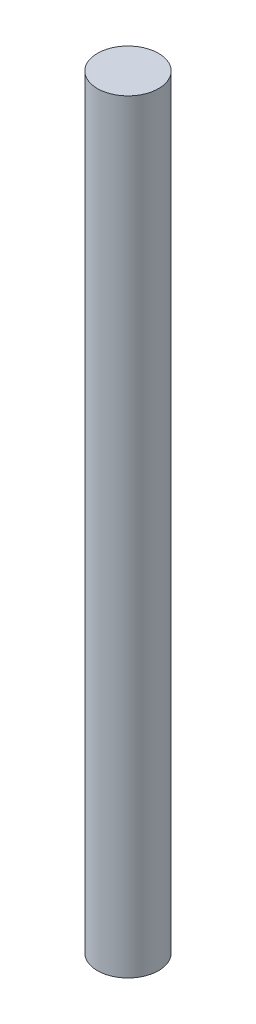
ISO-10303-21;
HEADER;
FILE_DESCRIPTION(('STEP AP214'),'2;1');
FILE_NAME('part.step','',(''),(''),'','','');
FILE_SCHEMA(('AUTOMOTIVE_DESIGN { 1 0 10303 214 1 1 1 1 }'));
ENDSEC;
DATA;
#1=APPLICATION_CONTEXT('core data for automotive mechanical design processes');
#2=APPLICATION_PROTOCOL_DEFINITION('international standard','automotive_design',2000,#1);
#3=PRODUCT_CONTEXT('',#1,'mechanical');
#4=PRODUCT('Part','Part','',(#3));
#5=PRODUCT_RELATED_PRODUCT_CATEGORY('part','',(#4));
#6=PRODUCT_DEFINITION_FORMATION('','',#4);
#7=PRODUCT_DEFINITION_CONTEXT('part definition',#1,'design');
#8=PRODUCT_DEFINITION('design','',#6,#7);
#9=PRODUCT_DEFINITION_SHAPE('','',#8);
#10=(LENGTH_UNIT() NAMED_UNIT(*) SI_UNIT(.MILLI.,.METRE.));
#11=(NAMED_UNIT(*) PLANE_ANGLE_UNIT() SI_UNIT($,.RADIAN.));
#12=(NAMED_UNIT(*) SI_UNIT($,.STERADIAN.) SOLID_ANGLE_UNIT());
#13=UNCERTAINTY_MEASURE_WITH_UNIT(LENGTH_MEASURE(1.E-05),#10,'distance_accuracy_value','');
#14=(GEOMETRIC_REPRESENTATION_CONTEXT(3) GLOBAL_UNCERTAINTY_ASSIGNED_CONTEXT((#13)) GLOBAL_UNIT_ASSIGNED_CONTEXT((#10,
#11,#12)) REPRESENTATION_CONTEXT('',''));
#15=CARTESIAN_POINT('',(0.,0.,0.));
#16=DIRECTION('',(0.,0.,1.));
#17=DIRECTION('',(1.,0.,0.));
#18=AXIS2_PLACEMENT_3D('',#15,#16,#17);
#19=CARTESIAN_POINT('',(0.,12.5,0.));
#20=DIRECTION('',(0.,-1.,0.));
#21=DIRECTION('',(0.,0.,-1.));
#22=AXIS2_PLACEMENT_3D('',#19,#20,#21);
#23=CYLINDRICAL_SURFACE('',#22,0.5);
#24=CARTESIAN_POINT('',(0.,12.5,0.));
#25=DIRECTION('',(0.,1.,0.));
#26=DIRECTION('',(0.,0.,1.));
#27=AXIS2_PLACEMENT_3D('',#24,#25,#26);
#28=CIRCLE('',#27,0.5);
#29=CARTESIAN_POINT('',(0.,12.5,0.5));
#30=VERTEX_POINT('',#29);
#31=EDGE_CURVE('E10',#30,#30,#28,.T.);
#32=ORIENTED_EDGE('',*,*,#31,.F.);
#33=EDGE_LOOP('',(#32));
#34=FACE_BOUND('',#33,.T.);
#35=CARTESIAN_POINT('',(0.,0.,0.));
#36=DIRECTION('',(0.,1.,0.));
#37=DIRECTION('',(0.,0.,1.));
#38=AXIS2_PLACEMENT_3D('',#35,#36,#37);
#39=CIRCLE('',#38,0.5);
#40=CARTESIAN_POINT('',(0.,0.,0.5));
#41=VERTEX_POINT('',#40);
#42=EDGE_CURVE('E40',#41,#41,#39,.T.);
#43=ORIENTED_EDGE('',*,*,#42,.T.);
#44=EDGE_LOOP('',(#43));
#45=FACE_BOUND('',#44,.T.);
#46=ADVANCED_FACE('F37',(#34,#45),#23,.T.);
#47=CARTESIAN_POINT('',(0.,12.5,0.));
#48=DIRECTION('',(0.,1.,0.));
#49=DIRECTION('',(0.,0.,1.));
#50=AXIS2_PLACEMENT_3D('',#47,#48,#49);
#51=PLANE('',#50);
#52=ORIENTED_EDGE('',*,*,#31,.T.);
#53=EDGE_LOOP('',(#52));
#54=FACE_BOUND('',#53,.T.);
#55=ADVANCED_FACE('F54',(#54),#51,.T.);
#56=CARTESIAN_POINT('',(0.,0.,0.));
#57=DIRECTION('',(0.,1.,0.));
#58=DIRECTION('',(0.,0.,1.));
#59=AXIS2_PLACEMENT_3D('',#56,#57,#58);
#60=PLANE('',#59);
#61=ORIENTED_EDGE('',*,*,#42,.F.);
#62=EDGE_LOOP('',(#61));
#63=FACE_BOUND('',#62,.T.);
#64=ADVANCED_FACE('F52',(#63),#60,.F.);
#65=CLOSED_SHELL('',(#46,#55,#64));
#66=MANIFOLD_SOLID_BREP('B2',#65);
#67=ADVANCED_BREP_SHAPE_REPRESENTATION('',(#18,#66),#14);
#68=SHAPE_DEFINITION_REPRESENTATION(#9,#67);
ENDSEC;
END-ISO-10303-21;
